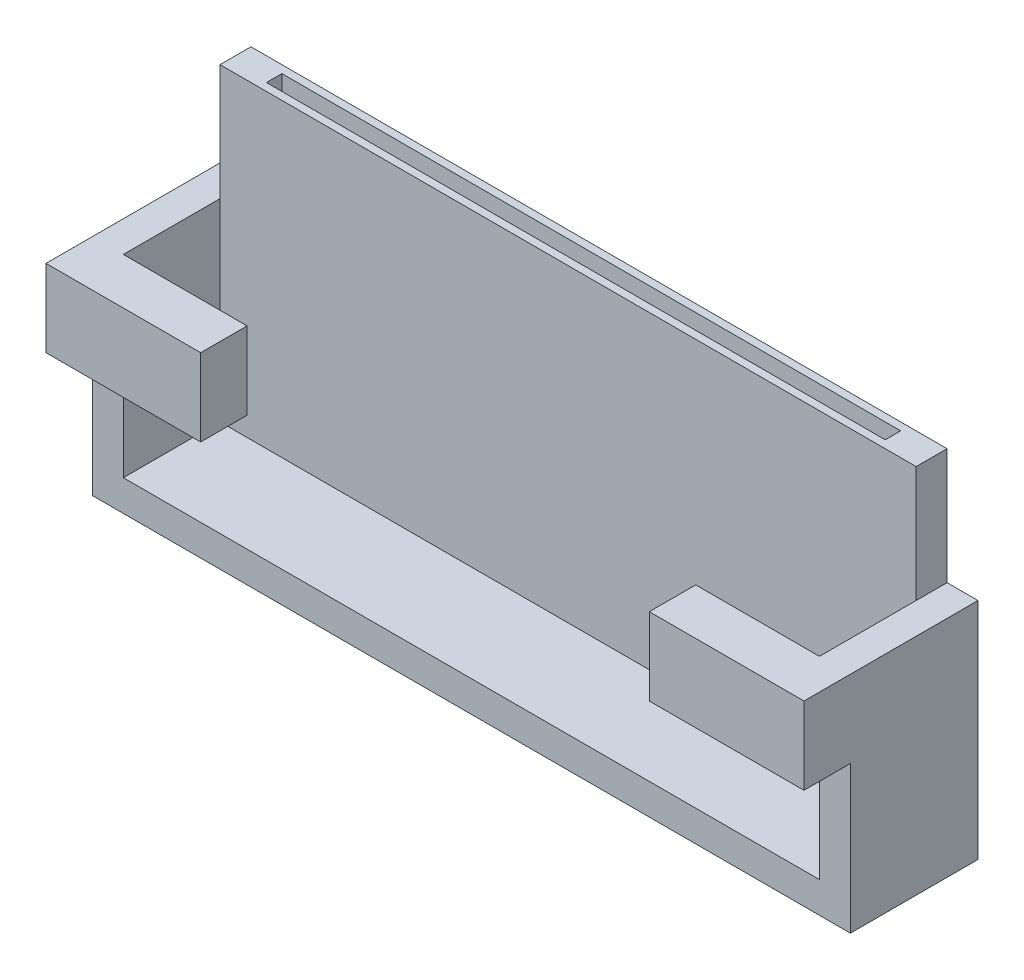
ISO-10303-21;
HEADER;
FILE_DESCRIPTION(('STEP AP214'),'2;1');
FILE_NAME('part.step','',(''),(''),'','','');
FILE_SCHEMA(('AUTOMOTIVE_DESIGN { 1 0 10303 214 1 1 1 1 }'));
ENDSEC;
DATA;
#1=APPLICATION_CONTEXT('core data for automotive mechanical design processes');
#2=APPLICATION_PROTOCOL_DEFINITION('international standard','automotive_design',2000,#1);
#3=PRODUCT_CONTEXT('',#1,'mechanical');
#4=PRODUCT('Part','Part','',(#3));
#5=PRODUCT_RELATED_PRODUCT_CATEGORY('part','',(#4));
#6=PRODUCT_DEFINITION_FORMATION('','',#4);
#7=PRODUCT_DEFINITION_CONTEXT('part definition',#1,'design');
#8=PRODUCT_DEFINITION('design','',#6,#7);
#9=PRODUCT_DEFINITION_SHAPE('','',#8);
#10=(LENGTH_UNIT() NAMED_UNIT(*) SI_UNIT(.MILLI.,.METRE.));
#11=(NAMED_UNIT(*) PLANE_ANGLE_UNIT() SI_UNIT($,.RADIAN.));
#12=(NAMED_UNIT(*) SI_UNIT($,.STERADIAN.) SOLID_ANGLE_UNIT());
#13=UNCERTAINTY_MEASURE_WITH_UNIT(LENGTH_MEASURE(1.E-05),#10,'distance_accuracy_value','');
#14=(GEOMETRIC_REPRESENTATION_CONTEXT(3) GLOBAL_UNCERTAINTY_ASSIGNED_CONTEXT((#13)) GLOBAL_UNIT_ASSIGNED_CONTEXT((#10,
#11,#12)) REPRESENTATION_CONTEXT('',''));
#15=CARTESIAN_POINT('',(0.,0.,0.));
#16=DIRECTION('',(0.,0.,1.));
#17=DIRECTION('',(1.,0.,0.));
#18=AXIS2_PLACEMENT_3D('',#15,#16,#17);
#19=CARTESIAN_POINT('',(22.5,0.,2.));
#20=DIRECTION('',(1.,0.,0.));
#21=DIRECTION('',(0.,1.,0.));
#22=AXIS2_PLACEMENT_3D('',#19,#20,#21);
#23=PLANE('',#22);
#24=DIRECTION('',(0.,0.,-1.));
#25=VECTOR('',#24,1.);
#26=CARTESIAN_POINT('',(22.5,2.5,8.25));
#27=LINE('',#26,#25);
#28=CARTESIAN_POINT('',(22.5,2.5,2.));
#29=VERTEX_POINT('',#28);
#30=CARTESIAN_POINT('',(22.5,2.5,0.));
#31=VERTEX_POINT('',#30);
#32=EDGE_CURVE('E520',#29,#31,#27,.T.);
#33=ORIENTED_EDGE('',*,*,#32,.T.);
#34=DIRECTION('',(0.,-1.,0.));
#35=VECTOR('',#34,1.);
#36=CARTESIAN_POINT('',(22.5,0.,0.));
#37=LINE('',#36,#35);
#38=CARTESIAN_POINT('',(22.5,10.,0.));
#39=VERTEX_POINT('',#38);
#40=EDGE_CURVE('E531',#39,#31,#37,.T.);
#41=ORIENTED_EDGE('',*,*,#40,.F.);
#42=DIRECTION('',(0.,0.,-1.));
#43=VECTOR('',#42,1.);
#44=CARTESIAN_POINT('',(22.5,10.,2.));
#45=LINE('',#44,#43);
#46=CARTESIAN_POINT('',(22.5,10.,2.));
#47=VERTEX_POINT('',#46);
#48=EDGE_CURVE('E79',#47,#39,#45,.T.);
#49=ORIENTED_EDGE('',*,*,#48,.F.);
#50=DIRECTION('',(0.,-1.,0.));
#51=VECTOR('',#50,1.);
#52=CARTESIAN_POINT('',(22.5,0.,2.));
#53=LINE('',#52,#51);
#54=EDGE_CURVE('E532',#47,#29,#53,.T.);
#55=ORIENTED_EDGE('',*,*,#54,.T.);
#56=EDGE_LOOP('',(#33,#41,#49,#55));
#57=FACE_BOUND('',#56,.T.);
#58=ADVANCED_FACE('F71',(#57),#23,.T.);
#59=CARTESIAN_POINT('',(0.,10.,2.));
#60=DIRECTION('',(0.,1.,0.));
#61=DIRECTION('',(0.,0.,1.));
#62=AXIS2_PLACEMENT_3D('',#59,#60,#61);
#63=PLANE('',#62);
#64=DIRECTION('',(0.,0.,1.));
#65=VECTOR('',#64,1.);
#66=CARTESIAN_POINT('',(-20.,10.,0.5));
#67=LINE('',#66,#65);
#68=CARTESIAN_POINT('',(-20.,10.,0.5));
#69=VERTEX_POINT('',#68);
#70=CARTESIAN_POINT('',(-20.,10.,1.5));
#71=VERTEX_POINT('',#70);
#72=EDGE_CURVE('E96',#69,#71,#67,.T.);
#73=ORIENTED_EDGE('',*,*,#72,.F.);
#74=DIRECTION('',(-1.,0.,0.));
#75=VECTOR('',#74,1.);
#76=CARTESIAN_POINT('',(-20.,10.,0.5));
#77=LINE('',#76,#75);
#78=CARTESIAN_POINT('',(20.,10.,0.5));
#79=VERTEX_POINT('',#78);
#80=EDGE_CURVE('E410',#79,#69,#77,.T.);
#81=ORIENTED_EDGE('',*,*,#80,.F.);
#82=DIRECTION('',(0.,0.,-1.));
#83=VECTOR('',#82,1.);
#84=CARTESIAN_POINT('',(20.,10.,0.5));
#85=LINE('',#84,#83);
#86=CARTESIAN_POINT('',(20.,10.,1.5));
#87=VERTEX_POINT('',#86);
#88=EDGE_CURVE('E402',#87,#79,#85,.T.);
#89=ORIENTED_EDGE('',*,*,#88,.F.);
#90=DIRECTION('',(1.,0.,0.));
#91=VECTOR('',#90,1.);
#92=CARTESIAN_POINT('',(-20.,10.,1.5));
#93=LINE('',#92,#91);
#94=EDGE_CURVE('E397',#71,#87,#93,.T.);
#95=ORIENTED_EDGE('',*,*,#94,.F.);
#96=EDGE_LOOP('',(#73,#81,#89,#95));
#97=FACE_BOUND('',#96,.T.);
#98=DIRECTION('',(1.,0.,0.));
#99=VECTOR('',#98,1.);
#100=CARTESIAN_POINT('',(0.,10.,0.));
#101=LINE('',#100,#99);
#102=CARTESIAN_POINT('',(-22.5,10.,0.));
#103=VERTEX_POINT('',#102);
#104=EDGE_CURVE('E547',#103,#39,#101,.T.);
#105=ORIENTED_EDGE('',*,*,#104,.F.);
#106=DIRECTION('',(0.,0.,-1.));
#107=VECTOR('',#106,1.);
#108=CARTESIAN_POINT('',(-22.5,10.,2.));
#109=LINE('',#108,#107);
#110=CARTESIAN_POINT('',(-22.5,10.,2.));
#111=VERTEX_POINT('',#110);
#112=EDGE_CURVE('E544',#111,#103,#109,.T.);
#113=ORIENTED_EDGE('',*,*,#112,.F.);
#114=DIRECTION('',(1.,0.,0.));
#115=VECTOR('',#114,1.);
#116=CARTESIAN_POINT('',(0.,10.,2.));
#117=LINE('',#116,#115);
#118=EDGE_CURVE('E535',#111,#47,#117,.T.);
#119=ORIENTED_EDGE('',*,*,#118,.T.);
#120=ORIENTED_EDGE('',*,*,#48,.T.);
#121=EDGE_LOOP('',(#105,#113,#119,#120));
#122=FACE_BOUND('',#121,.T.);
#123=ADVANCED_FACE('F556',(#97,#122),#63,.T.);
#124=CARTESIAN_POINT('',(-22.5,0.,2.));
#125=DIRECTION('',(1.,0.,0.));
#126=DIRECTION('',(0.,1.,0.));
#127=AXIS2_PLACEMENT_3D('',#124,#125,#126);
#128=PLANE('',#127);
#129=DIRECTION('',(0.,-1.,0.));
#130=VECTOR('',#129,1.);
#131=CARTESIAN_POINT('',(-22.5,0.,0.));
#132=LINE('',#131,#130);
#133=CARTESIAN_POINT('',(-22.5,2.5,0.));
#134=VERTEX_POINT('',#133);
#135=EDGE_CURVE('E536',#103,#134,#132,.T.);
#136=ORIENTED_EDGE('',*,*,#135,.T.);
#137=DIRECTION('',(0.,0.,-1.));
#138=VECTOR('',#137,1.);
#139=CARTESIAN_POINT('',(-22.5,2.5,8.25));
#140=LINE('',#139,#138);
#141=CARTESIAN_POINT('',(-22.5,2.5,2.));
#142=VERTEX_POINT('',#141);
#143=EDGE_CURVE('E510',#142,#134,#140,.T.);
#144=ORIENTED_EDGE('',*,*,#143,.F.);
#145=DIRECTION('',(0.,-1.,0.));
#146=VECTOR('',#145,1.);
#147=CARTESIAN_POINT('',(-22.5,0.,2.));
#148=LINE('',#147,#146);
#149=EDGE_CURVE('E539',#111,#142,#148,.T.);
#150=ORIENTED_EDGE('',*,*,#149,.F.);
#151=ORIENTED_EDGE('',*,*,#112,.T.);
#152=EDGE_LOOP('',(#136,#144,#150,#151));
#153=FACE_BOUND('',#152,.T.);
#154=ADVANCED_FACE('F566',(#153),#128,.F.);
#155=CARTESIAN_POINT('',(0.,0.,2.));
#156=DIRECTION('',(0.,0.,1.));
#157=DIRECTION('',(1.,0.,0.));
#158=AXIS2_PLACEMENT_3D('',#155,#156,#157);
#159=PLANE('',#158);
#160=ORIENTED_EDGE('',*,*,#54,.F.);
#161=ORIENTED_EDGE('',*,*,#118,.F.);
#162=ORIENTED_EDGE('',*,*,#149,.T.);
#163=DIRECTION('',(0.,1.,0.));
#164=VECTOR('',#163,1.);
#165=CARTESIAN_POINT('',(-22.5,0.,2.));
#166=LINE('',#165,#164);
#167=CARTESIAN_POINT('',(-22.5,-10.,2.));
#168=VERTEX_POINT('',#167);
#169=EDGE_CURVE('E526',#168,#142,#166,.T.);
#170=ORIENTED_EDGE('',*,*,#169,.F.);
#171=DIRECTION('',(1.,0.,0.));
#172=VECTOR('',#171,1.);
#173=CARTESIAN_POINT('',(0.,-10.,2.));
#174=LINE('',#173,#172);
#175=CARTESIAN_POINT('',(22.5,-10.,2.));
#176=VERTEX_POINT('',#175);
#177=EDGE_CURVE('E542',#168,#176,#174,.T.);
#178=ORIENTED_EDGE('',*,*,#177,.T.);
#179=DIRECTION('',(0.,1.,0.));
#180=VECTOR('',#179,1.);
#181=CARTESIAN_POINT('',(22.5,0.,2.));
#182=LINE('',#181,#180);
#183=EDGE_CURVE('E529',#176,#29,#182,.T.);
#184=ORIENTED_EDGE('',*,*,#183,.T.);
#185=EDGE_LOOP('',(#160,#161,#162,#170,#178,#184));
#186=FACE_BOUND('',#185,.T.);
#187=ADVANCED_FACE('F628',(#186),#159,.T.);
#188=CARTESIAN_POINT('',(0.,0.,0.));
#189=DIRECTION('',(0.,0.,1.));
#190=DIRECTION('',(1.,0.,0.));
#191=AXIS2_PLACEMENT_3D('',#188,#189,#190);
#192=PLANE('',#191);
#193=DIRECTION('',(1.,0.,0.));
#194=VECTOR('',#193,1.);
#195=CARTESIAN_POINT('',(7.50000000000001,1.5,0.));
#196=LINE('',#195,#194);
#197=CARTESIAN_POINT('',(-7.49999999999999,1.5,0.));
#198=VERTEX_POINT('',#197);
#199=CARTESIAN_POINT('',(7.50000000000001,1.5,0.));
#200=VERTEX_POINT('',#199);
#201=EDGE_CURVE('E259',#198,#200,#196,.T.);
#202=ORIENTED_EDGE('',*,*,#201,.F.);
#203=DIRECTION('',(0.,1.,0.));
#204=VECTOR('',#203,1.);
#205=CARTESIAN_POINT('',(-7.49999999999999,1.5,0.));
#206=LINE('',#205,#204);
#207=CARTESIAN_POINT('',(-7.5,-1.5,0.));
#208=VERTEX_POINT('',#207);
#209=EDGE_CURVE('E268',#208,#198,#206,.T.);
#210=ORIENTED_EDGE('',*,*,#209,.F.);
#211=DIRECTION('',(-1.,0.,0.));
#212=VECTOR('',#211,1.);
#213=CARTESIAN_POINT('',(7.50000000000001,-1.5,0.));
#214=LINE('',#213,#212);
#215=CARTESIAN_POINT('',(7.5,-1.5,0.));
#216=VERTEX_POINT('',#215);
#217=EDGE_CURVE('E266',#216,#208,#214,.T.);
#218=ORIENTED_EDGE('',*,*,#217,.F.);
#219=DIRECTION('',(0.,-1.,0.));
#220=VECTOR('',#219,1.);
#221=CARTESIAN_POINT('',(7.50000000000001,1.5,0.));
#222=LINE('',#221,#220);
#223=EDGE_CURVE('E251',#200,#216,#222,.T.);
#224=ORIENTED_EDGE('',*,*,#223,.F.);
#225=EDGE_LOOP('',(#202,#210,#218,#224));
#226=FACE_BOUND('',#225,.T.);
#227=ORIENTED_EDGE('',*,*,#40,.T.);
#228=DIRECTION('',(1.,0.,0.));
#229=VECTOR('',#228,1.);
#230=CARTESIAN_POINT('',(0.,2.5,0.));
#231=LINE('',#230,#229);
#232=CARTESIAN_POINT('',(24.5,2.5,0.));
#233=VERTEX_POINT('',#232);
#234=EDGE_CURVE('E496',#31,#233,#231,.T.);
#235=ORIENTED_EDGE('',*,*,#234,.T.);
#236=DIRECTION('',(0.,-1.,0.));
#237=VECTOR('',#236,1.);
#238=CARTESIAN_POINT('',(24.5,0.,0.));
#239=LINE('',#238,#237);
#240=CARTESIAN_POINT('',(24.5,-12.,0.));
#241=VERTEX_POINT('',#240);
#242=EDGE_CURVE('E451',#233,#241,#239,.T.);
#243=ORIENTED_EDGE('',*,*,#242,.T.);
#244=DIRECTION('',(1.,0.,0.));
#245=VECTOR('',#244,1.);
#246=CARTESIAN_POINT('',(0.,-12.,0.));
#247=LINE('',#246,#245);
#248=CARTESIAN_POINT('',(-24.5,-12.,0.));
#249=VERTEX_POINT('',#248);
#250=EDGE_CURVE('E478',#249,#241,#247,.T.);
#251=ORIENTED_EDGE('',*,*,#250,.F.);
#252=DIRECTION('',(0.,-1.,0.));
#253=VECTOR('',#252,1.);
#254=CARTESIAN_POINT('',(-24.5,0.,0.));
#255=LINE('',#254,#253);
#256=CARTESIAN_POINT('',(-24.5,2.5,0.));
#257=VERTEX_POINT('',#256);
#258=EDGE_CURVE('E500',#257,#249,#255,.T.);
#259=ORIENTED_EDGE('',*,*,#258,.F.);
#260=EDGE_CURVE('E499',#257,#134,#231,.T.);
#261=ORIENTED_EDGE('',*,*,#260,.T.);
#262=ORIENTED_EDGE('',*,*,#135,.F.);
#263=ORIENTED_EDGE('',*,*,#104,.T.);
#264=EDGE_LOOP('',(#227,#235,#243,#251,#259,#261,#262,#263));
#265=FACE_BOUND('',#264,.T.);
#266=ADVANCED_FACE('F264',(#226,#265),#192,.F.);
#267=CARTESIAN_POINT('',(24.5,0.,8.25));
#268=DIRECTION('',(1.,0.,0.));
#269=DIRECTION('',(0.,1.,0.));
#270=AXIS2_PLACEMENT_3D('',#267,#268,#269);
#271=PLANE('',#270);
#272=ORIENTED_EDGE('',*,*,#242,.F.);
#273=DIRECTION('',(0.,0.,-1.));
#274=VECTOR('',#273,1.);
#275=CARTESIAN_POINT('',(24.5,2.5,8.25));
#276=LINE('',#275,#274);
#277=CARTESIAN_POINT('',(24.5,2.50000000000004,11.25));
#278=VERTEX_POINT('',#277);
#279=EDGE_CURVE('E524',#278,#233,#276,.T.);
#280=ORIENTED_EDGE('',*,*,#279,.F.);
#281=DIRECTION('',(0.,1.,0.));
#282=VECTOR('',#281,1.);
#283=CARTESIAN_POINT('',(24.5,2.50000000000004,11.25));
#284=LINE('',#283,#282);
#285=CARTESIAN_POINT('',(24.5,-2.49999999999996,11.25));
#286=VERTEX_POINT('',#285);
#287=EDGE_CURVE('E459',#286,#278,#284,.T.);
#288=ORIENTED_EDGE('',*,*,#287,.F.);
#289=DIRECTION('',(0.,0.,-1.));
#290=VECTOR('',#289,1.);
#291=CARTESIAN_POINT('',(24.5,-2.49999999999996,11.25));
#292=LINE('',#291,#290);
#293=CARTESIAN_POINT('',(24.5,-2.49999999999996,8.25));
#294=VERTEX_POINT('',#293);
#295=EDGE_CURVE('E457',#286,#294,#292,.T.);
#296=ORIENTED_EDGE('',*,*,#295,.T.);
#297=DIRECTION('',(0.,-1.,0.));
#298=VECTOR('',#297,1.);
#299=CARTESIAN_POINT('',(24.5,0.,8.25));
#300=LINE('',#299,#298);
#301=CARTESIAN_POINT('',(24.5,-12.,8.25));
#302=VERTEX_POINT('',#301);
#303=EDGE_CURVE('E475',#294,#302,#300,.T.);
#304=ORIENTED_EDGE('',*,*,#303,.T.);
#305=DIRECTION('',(0.,0.,-1.));
#306=VECTOR('',#305,1.);
#307=CARTESIAN_POINT('',(24.5,-12.,8.25));
#308=LINE('',#307,#306);
#309=EDGE_CURVE('E493',#302,#241,#308,.T.);
#310=ORIENTED_EDGE('',*,*,#309,.T.);
#311=EDGE_LOOP('',(#272,#280,#288,#296,#304,#310));
#312=FACE_BOUND('',#311,.T.);
#313=ADVANCED_FACE('F604',(#312),#271,.T.);
#314=CARTESIAN_POINT('',(0.,2.5,8.25));
#315=DIRECTION('',(0.,1.,0.));
#316=DIRECTION('',(0.,0.,1.));
#317=AXIS2_PLACEMENT_3D('',#314,#315,#316);
#318=PLANE('',#317);
#319=ORIENTED_EDGE('',*,*,#234,.F.);
#320=ORIENTED_EDGE('',*,*,#32,.F.);
#321=CARTESIAN_POINT('',(22.5,2.5,8.25));
#322=VERTEX_POINT('',#321);
#323=EDGE_CURVE('E521',#322,#29,#27,.T.);
#324=ORIENTED_EDGE('',*,*,#323,.F.);
#325=DIRECTION('',(-1.,0.,0.));
#326=VECTOR('',#325,1.);
#327=CARTESIAN_POINT('',(24.5,2.50000000000004,8.25));
#328=LINE('',#327,#326);
#329=CARTESIAN_POINT('',(14.5,2.50000000000002,8.25));
#330=VERTEX_POINT('',#329);
#331=EDGE_CURVE('E465',#322,#330,#328,.T.);
#332=ORIENTED_EDGE('',*,*,#331,.T.);
#333=DIRECTION('',(0.,0.,-1.));
#334=VECTOR('',#333,1.);
#335=CARTESIAN_POINT('',(14.5,2.50000000000002,11.25));
#336=LINE('',#335,#334);
#337=CARTESIAN_POINT('',(14.5,2.50000000000002,11.25));
#338=VERTEX_POINT('',#337);
#339=EDGE_CURVE('E416',#338,#330,#336,.T.);
#340=ORIENTED_EDGE('',*,*,#339,.F.);
#341=DIRECTION('',(-1.,0.,0.));
#342=VECTOR('',#341,1.);
#343=CARTESIAN_POINT('',(24.5,2.50000000000004,11.25));
#344=LINE('',#343,#342);
#345=EDGE_CURVE('E463',#278,#338,#344,.T.);
#346=ORIENTED_EDGE('',*,*,#345,.F.);
#347=ORIENTED_EDGE('',*,*,#279,.T.);
#348=EDGE_LOOP('',(#319,#320,#324,#332,#340,#346,#347));
#349=FACE_BOUND('',#348,.T.);
#350=ADVANCED_FACE('F610',(#349),#318,.T.);
#351=CARTESIAN_POINT('',(22.5,0.,8.25));
#352=DIRECTION('',(1.,0.,0.));
#353=DIRECTION('',(0.,1.,0.));
#354=AXIS2_PLACEMENT_3D('',#351,#352,#353);
#355=PLANE('',#354);
#356=ORIENTED_EDGE('',*,*,#183,.F.);
#357=DIRECTION('',(0.,0.,-1.));
#358=VECTOR('',#357,1.);
#359=CARTESIAN_POINT('',(22.5,-10.,8.25));
#360=LINE('',#359,#358);
#361=CARTESIAN_POINT('',(22.5,-10.,8.25));
#362=VERTEX_POINT('',#361);
#363=EDGE_CURVE('E517',#362,#176,#360,.T.);
#364=ORIENTED_EDGE('',*,*,#363,.F.);
#365=DIRECTION('',(0.,-1.,0.));
#366=VECTOR('',#365,1.);
#367=CARTESIAN_POINT('',(22.5,0.,8.25));
#368=LINE('',#367,#366);
#369=CARTESIAN_POINT('',(22.5,-2.49999999999997,8.25));
#370=VERTEX_POINT('',#369);
#371=EDGE_CURVE('E477',#370,#362,#368,.T.);
#372=ORIENTED_EDGE('',*,*,#371,.F.);
#373=EDGE_CURVE('E479',#322,#370,#368,.T.);
#374=ORIENTED_EDGE('',*,*,#373,.F.);
#375=ORIENTED_EDGE('',*,*,#323,.T.);
#376=EDGE_LOOP('',(#356,#364,#372,#374,#375));
#377=FACE_BOUND('',#376,.T.);
#378=ADVANCED_FACE('F621',(#377),#355,.F.);
#379=CARTESIAN_POINT('',(0.,-10.,8.25));
#380=DIRECTION('',(0.,1.,0.));
#381=DIRECTION('',(0.,0.,1.));
#382=AXIS2_PLACEMENT_3D('',#379,#380,#381);
#383=PLANE('',#382);
#384=ORIENTED_EDGE('',*,*,#363,.T.);
#385=ORIENTED_EDGE('',*,*,#177,.F.);
#386=DIRECTION('',(0.,0.,-1.));
#387=VECTOR('',#386,1.);
#388=CARTESIAN_POINT('',(-22.5,-10.,8.25));
#389=LINE('',#388,#387);
#390=CARTESIAN_POINT('',(-22.5,-10.,8.25));
#391=VERTEX_POINT('',#390);
#392=EDGE_CURVE('E514',#391,#168,#389,.T.);
#393=ORIENTED_EDGE('',*,*,#392,.F.);
#394=DIRECTION('',(1.,0.,0.));
#395=VECTOR('',#394,1.);
#396=CARTESIAN_POINT('',(0.,-10.,8.25));
#397=LINE('',#396,#395);
#398=EDGE_CURVE('E482',#391,#362,#397,.T.);
#399=ORIENTED_EDGE('',*,*,#398,.T.);
#400=EDGE_LOOP('',(#384,#385,#393,#399));
#401=FACE_BOUND('',#400,.T.);
#402=ADVANCED_FACE('F625',(#401),#383,.T.);
#403=CARTESIAN_POINT('',(-22.5,0.,8.25));
#404=DIRECTION('',(1.,0.,0.));
#405=DIRECTION('',(0.,1.,0.));
#406=AXIS2_PLACEMENT_3D('',#403,#404,#405);
#407=PLANE('',#406);
#408=ORIENTED_EDGE('',*,*,#392,.T.);
#409=ORIENTED_EDGE('',*,*,#169,.T.);
#410=CARTESIAN_POINT('',(-22.5,2.5,8.25));
#411=VERTEX_POINT('',#410);
#412=EDGE_CURVE('E511',#411,#142,#140,.T.);
#413=ORIENTED_EDGE('',*,*,#412,.F.);
#414=DIRECTION('',(0.,-1.,0.));
#415=VECTOR('',#414,1.);
#416=CARTESIAN_POINT('',(-22.5,0.,8.25));
#417=LINE('',#416,#415);
#418=CARTESIAN_POINT('',(-22.5,-2.5,8.25));
#419=VERTEX_POINT('',#418);
#420=EDGE_CURVE('E486',#411,#419,#417,.T.);
#421=ORIENTED_EDGE('',*,*,#420,.T.);
#422=EDGE_CURVE('E485',#419,#391,#417,.T.);
#423=ORIENTED_EDGE('',*,*,#422,.T.);
#424=EDGE_LOOP('',(#408,#409,#413,#421,#423));
#425=FACE_BOUND('',#424,.T.);
#426=ADVANCED_FACE('F572',(#425),#407,.T.);
#427=ORIENTED_EDGE('',*,*,#260,.F.);
#428=DIRECTION('',(0.,0.,-1.));
#429=VECTOR('',#428,1.);
#430=CARTESIAN_POINT('',(-24.5,2.5,8.25));
#431=LINE('',#430,#429);
#432=CARTESIAN_POINT('',(-24.5,2.5,11.25));
#433=VERTEX_POINT('',#432);
#434=EDGE_CURVE('E508',#433,#257,#431,.T.);
#435=ORIENTED_EDGE('',*,*,#434,.F.);
#436=DIRECTION('',(-1.,0.,0.));
#437=VECTOR('',#436,1.);
#438=CARTESIAN_POINT('',(-24.5,2.5,11.25));
#439=LINE('',#438,#437);
#440=CARTESIAN_POINT('',(-14.5,2.5,11.25));
#441=VERTEX_POINT('',#440);
#442=EDGE_CURVE('E431',#441,#433,#439,.T.);
#443=ORIENTED_EDGE('',*,*,#442,.F.);
#444=DIRECTION('',(0.,0.,-1.));
#445=VECTOR('',#444,1.);
#446=CARTESIAN_POINT('',(-14.5,2.5,11.25));
#447=LINE('',#446,#445);
#448=CARTESIAN_POINT('',(-14.5,2.5,8.25));
#449=VERTEX_POINT('',#448);
#450=EDGE_CURVE('E434',#441,#449,#447,.T.);
#451=ORIENTED_EDGE('',*,*,#450,.T.);
#452=DIRECTION('',(-1.,0.,0.));
#453=VECTOR('',#452,1.);
#454=CARTESIAN_POINT('',(-24.5,2.5,8.25));
#455=LINE('',#454,#453);
#456=EDGE_CURVE('E427',#449,#411,#455,.T.);
#457=ORIENTED_EDGE('',*,*,#456,.T.);
#458=ORIENTED_EDGE('',*,*,#412,.T.);
#459=ORIENTED_EDGE('',*,*,#143,.T.);
#460=EDGE_LOOP('',(#427,#435,#443,#451,#457,#458,#459));
#461=FACE_BOUND('',#460,.T.);
#462=ADVANCED_FACE('F568',(#461),#318,.T.);
#463=CARTESIAN_POINT('',(-24.5,0.,8.25));
#464=DIRECTION('',(1.,0.,0.));
#465=DIRECTION('',(0.,1.,0.));
#466=AXIS2_PLACEMENT_3D('',#463,#464,#465);
#467=PLANE('',#466);
#468=ORIENTED_EDGE('',*,*,#258,.T.);
#469=DIRECTION('',(0.,0.,-1.));
#470=VECTOR('',#469,1.);
#471=CARTESIAN_POINT('',(-24.5,-12.,8.25));
#472=LINE('',#471,#470);
#473=CARTESIAN_POINT('',(-24.5,-12.,8.25));
#474=VERTEX_POINT('',#473);
#475=EDGE_CURVE('E505',#474,#249,#472,.T.);
#476=ORIENTED_EDGE('',*,*,#475,.F.);
#477=DIRECTION('',(0.,-1.,0.));
#478=VECTOR('',#477,1.);
#479=CARTESIAN_POINT('',(-24.5,0.,8.25));
#480=LINE('',#479,#478);
#481=CARTESIAN_POINT('',(-24.5,-2.5,8.25));
#482=VERTEX_POINT('',#481);
#483=EDGE_CURVE('E488',#482,#474,#480,.T.);
#484=ORIENTED_EDGE('',*,*,#483,.F.);
#485=DIRECTION('',(0.,0.,-1.));
#486=VECTOR('',#485,1.);
#487=CARTESIAN_POINT('',(-24.5,-2.5,11.25));
#488=LINE('',#487,#486);
#489=CARTESIAN_POINT('',(-24.5,-2.5,11.25));
#490=VERTEX_POINT('',#489);
#491=EDGE_CURVE('E448',#490,#482,#488,.T.);
#492=ORIENTED_EDGE('',*,*,#491,.F.);
#493=DIRECTION('',(0.,-1.,0.));
#494=VECTOR('',#493,1.);
#495=CARTESIAN_POINT('',(-24.5,2.5,11.25));
#496=LINE('',#495,#494);
#497=EDGE_CURVE('E423',#433,#490,#496,.T.);
#498=ORIENTED_EDGE('',*,*,#497,.F.);
#499=ORIENTED_EDGE('',*,*,#434,.T.);
#500=EDGE_LOOP('',(#468,#476,#484,#492,#498,#499));
#501=FACE_BOUND('',#500,.T.);
#502=ADVANCED_FACE('F588',(#501),#467,.F.);
#503=CARTESIAN_POINT('',(0.,-12.,8.25));
#504=DIRECTION('',(0.,1.,0.));
#505=DIRECTION('',(0.,0.,1.));
#506=AXIS2_PLACEMENT_3D('',#503,#504,#505);
#507=PLANE('',#506);
#508=ORIENTED_EDGE('',*,*,#250,.T.);
#509=ORIENTED_EDGE('',*,*,#309,.F.);
#510=DIRECTION('',(1.,0.,0.));
#511=VECTOR('',#510,1.);
#512=CARTESIAN_POINT('',(0.,-12.,8.25));
#513=LINE('',#512,#511);
#514=EDGE_CURVE('E490',#474,#302,#513,.T.);
#515=ORIENTED_EDGE('',*,*,#514,.F.);
#516=ORIENTED_EDGE('',*,*,#475,.T.);
#517=EDGE_LOOP('',(#508,#509,#515,#516));
#518=FACE_BOUND('',#517,.T.);
#519=ADVANCED_FACE('F594',(#518),#507,.F.);
#520=CARTESIAN_POINT('',(0.,0.,8.25));
#521=DIRECTION('',(0.,0.,1.));
#522=DIRECTION('',(1.,0.,0.));
#523=AXIS2_PLACEMENT_3D('',#520,#521,#522);
#524=PLANE('',#523);
#525=DIRECTION('',(1.,0.,0.));
#526=VECTOR('',#525,1.);
#527=CARTESIAN_POINT('',(-24.5,-2.5,8.25));
#528=LINE('',#527,#526);
#529=EDGE_CURVE('E435',#482,#419,#528,.T.);
#530=ORIENTED_EDGE('',*,*,#529,.F.);
#531=ORIENTED_EDGE('',*,*,#483,.T.);
#532=ORIENTED_EDGE('',*,*,#514,.T.);
#533=ORIENTED_EDGE('',*,*,#303,.F.);
#534=DIRECTION('',(1.,0.,0.));
#535=VECTOR('',#534,1.);
#536=CARTESIAN_POINT('',(24.5,-2.49999999999996,8.25));
#537=LINE('',#536,#535);
#538=EDGE_CURVE('E12',#370,#294,#537,.T.);
#539=ORIENTED_EDGE('',*,*,#538,.F.);
#540=ORIENTED_EDGE('',*,*,#371,.T.);
#541=ORIENTED_EDGE('',*,*,#398,.F.);
#542=ORIENTED_EDGE('',*,*,#422,.F.);
#543=EDGE_LOOP('',(#530,#531,#532,#533,#539,#540,#541,#542));
#544=FACE_BOUND('',#543,.T.);
#545=ADVANCED_FACE('F584',(#544),#524,.T.);
#546=CARTESIAN_POINT('',(0.,0.,8.25));
#547=DIRECTION('',(0.,0.,1.));
#548=DIRECTION('',(1.,0.,0.));
#549=AXIS2_PLACEMENT_3D('',#546,#547,#548);
#550=PLANE('',#549);
#551=ORIENTED_EDGE('',*,*,#331,.F.);
#552=ORIENTED_EDGE('',*,*,#373,.T.);
#553=CARTESIAN_POINT('',(14.5,-2.49999999999998,8.25));
#554=VERTEX_POINT('',#553);
#555=EDGE_CURVE('E81',#554,#370,#537,.T.);
#556=ORIENTED_EDGE('',*,*,#555,.F.);
#557=DIRECTION('',(0.,-1.,0.));
#558=VECTOR('',#557,1.);
#559=CARTESIAN_POINT('',(14.5,2.50000000000002,8.25));
#560=LINE('',#559,#558);
#561=EDGE_CURVE('E462',#330,#554,#560,.T.);
#562=ORIENTED_EDGE('',*,*,#561,.F.);
#563=EDGE_LOOP('',(#551,#552,#556,#562));
#564=FACE_BOUND('',#563,.T.);
#565=ADVANCED_FACE('F617',(#564),#550,.F.);
#566=CARTESIAN_POINT('',(14.5,2.50000000000002,11.25));
#567=DIRECTION('',(1.,0.,0.));
#568=DIRECTION('',(0.,1.,0.));
#569=AXIS2_PLACEMENT_3D('',#566,#567,#568);
#570=PLANE('',#569);
#571=ORIENTED_EDGE('',*,*,#561,.T.);
#572=DIRECTION('',(0.,0.,-1.));
#573=VECTOR('',#572,1.);
#574=CARTESIAN_POINT('',(14.5,-2.49999999999998,11.25));
#575=LINE('',#574,#573);
#576=CARTESIAN_POINT('',(14.5,-2.49999999999998,11.25));
#577=VERTEX_POINT('',#576);
#578=EDGE_CURVE('E454',#577,#554,#575,.T.);
#579=ORIENTED_EDGE('',*,*,#578,.F.);
#580=DIRECTION('',(0.,-1.,0.));
#581=VECTOR('',#580,1.);
#582=CARTESIAN_POINT('',(14.5,2.50000000000002,11.25));
#583=LINE('',#582,#581);
#584=EDGE_CURVE('E471',#338,#577,#583,.T.);
#585=ORIENTED_EDGE('',*,*,#584,.F.);
#586=ORIENTED_EDGE('',*,*,#339,.T.);
#587=EDGE_LOOP('',(#571,#579,#585,#586));
#588=FACE_BOUND('',#587,.T.);
#589=ADVANCED_FACE('F614',(#588),#570,.F.);
#590=CARTESIAN_POINT('',(24.5,-2.49999999999996,11.25));
#591=DIRECTION('',(0.,1.,0.));
#592=DIRECTION('',(-1.,0.,0.));
#593=AXIS2_PLACEMENT_3D('',#590,#591,#592);
#594=PLANE('',#593);
#595=ORIENTED_EDGE('',*,*,#555,.T.);
#596=ORIENTED_EDGE('',*,*,#538,.T.);
#597=ORIENTED_EDGE('',*,*,#295,.F.);
#598=DIRECTION('',(1.,0.,0.));
#599=VECTOR('',#598,1.);
#600=CARTESIAN_POINT('',(24.5,-2.49999999999996,11.25));
#601=LINE('',#600,#599);
#602=EDGE_CURVE('E469',#577,#286,#601,.T.);
#603=ORIENTED_EDGE('',*,*,#602,.F.);
#604=ORIENTED_EDGE('',*,*,#578,.T.);
#605=EDGE_LOOP('',(#595,#596,#597,#603,#604));
#606=FACE_BOUND('',#605,.T.);
#607=ADVANCED_FACE('F599',(#606),#594,.F.);
#608=CARTESIAN_POINT('',(0.,0.,11.25));
#609=DIRECTION('',(0.,0.,1.));
#610=DIRECTION('',(1.,0.,0.));
#611=AXIS2_PLACEMENT_3D('',#608,#609,#610);
#612=PLANE('',#611);
#613=ORIENTED_EDGE('',*,*,#345,.T.);
#614=ORIENTED_EDGE('',*,*,#584,.T.);
#615=ORIENTED_EDGE('',*,*,#602,.T.);
#616=ORIENTED_EDGE('',*,*,#287,.T.);
#617=EDGE_LOOP('',(#613,#614,#615,#616));
#618=FACE_BOUND('',#617,.T.);
#619=ADVANCED_FACE('F607',(#618),#612,.T.);
#620=CARTESIAN_POINT('',(-24.5,-2.5,11.25));
#621=DIRECTION('',(0.,1.,0.));
#622=DIRECTION('',(0.,0.,1.));
#623=AXIS2_PLACEMENT_3D('',#620,#621,#622);
#624=PLANE('',#623);
#625=ORIENTED_EDGE('',*,*,#529,.T.);
#626=CARTESIAN_POINT('',(-14.5,-2.5,8.25));
#627=VERTEX_POINT('',#626);
#628=EDGE_CURVE('E439',#419,#627,#528,.T.);
#629=ORIENTED_EDGE('',*,*,#628,.T.);
#630=DIRECTION('',(0.,0.,-1.));
#631=VECTOR('',#630,1.);
#632=CARTESIAN_POINT('',(-14.5,-2.5,11.25));
#633=LINE('',#632,#631);
#634=CARTESIAN_POINT('',(-14.5,-2.5,11.25));
#635=VERTEX_POINT('',#634);
#636=EDGE_CURVE('E445',#635,#627,#633,.T.);
#637=ORIENTED_EDGE('',*,*,#636,.F.);
#638=DIRECTION('',(1.,0.,0.));
#639=VECTOR('',#638,1.);
#640=CARTESIAN_POINT('',(-24.5,-2.5,11.25));
#641=LINE('',#640,#639);
#642=EDGE_CURVE('E426',#490,#635,#641,.T.);
#643=ORIENTED_EDGE('',*,*,#642,.F.);
#644=ORIENTED_EDGE('',*,*,#491,.T.);
#645=EDGE_LOOP('',(#625,#629,#637,#643,#644));
#646=FACE_BOUND('',#645,.T.);
#647=ADVANCED_FACE('F580',(#646),#624,.F.);
#648=CARTESIAN_POINT('',(-14.5,2.5,11.25));
#649=DIRECTION('',(-1.,0.,0.));
#650=DIRECTION('',(0.,0.,1.));
#651=AXIS2_PLACEMENT_3D('',#648,#649,#650);
#652=PLANE('',#651);
#653=DIRECTION('',(0.,1.,0.));
#654=VECTOR('',#653,1.);
#655=CARTESIAN_POINT('',(-14.5,2.5,8.25));
#656=LINE('',#655,#654);
#657=EDGE_CURVE('E438',#627,#449,#656,.T.);
#658=ORIENTED_EDGE('',*,*,#657,.T.);
#659=ORIENTED_EDGE('',*,*,#450,.F.);
#660=DIRECTION('',(0.,1.,0.));
#661=VECTOR('',#660,1.);
#662=CARTESIAN_POINT('',(-14.5,2.5,11.25));
#663=LINE('',#662,#661);
#664=EDGE_CURVE('E429',#635,#441,#663,.T.);
#665=ORIENTED_EDGE('',*,*,#664,.F.);
#666=ORIENTED_EDGE('',*,*,#636,.T.);
#667=EDGE_LOOP('',(#658,#659,#665,#666));
#668=FACE_BOUND('',#667,.T.);
#669=ADVANCED_FACE('F690',(#668),#652,.F.);
#670=CARTESIAN_POINT('',(0.,0.,11.25));
#671=DIRECTION('',(0.,0.,1.));
#672=DIRECTION('',(1.,0.,0.));
#673=AXIS2_PLACEMENT_3D('',#670,#671,#672);
#674=PLANE('',#673);
#675=ORIENTED_EDGE('',*,*,#497,.T.);
#676=ORIENTED_EDGE('',*,*,#642,.T.);
#677=ORIENTED_EDGE('',*,*,#664,.T.);
#678=ORIENTED_EDGE('',*,*,#442,.T.);
#679=EDGE_LOOP('',(#675,#676,#677,#678));
#680=FACE_BOUND('',#679,.T.);
#681=ADVANCED_FACE('F687',(#680),#674,.T.);
#682=CARTESIAN_POINT('',(0.,0.,8.25));
#683=DIRECTION('',(0.,0.,1.));
#684=DIRECTION('',(1.,0.,0.));
#685=AXIS2_PLACEMENT_3D('',#682,#683,#684);
#686=PLANE('',#685);
#687=ORIENTED_EDGE('',*,*,#420,.F.);
#688=ORIENTED_EDGE('',*,*,#456,.F.);
#689=ORIENTED_EDGE('',*,*,#657,.F.);
#690=ORIENTED_EDGE('',*,*,#628,.F.);
#691=EDGE_LOOP('',(#687,#688,#689,#690));
#692=FACE_BOUND('',#691,.T.);
#693=ADVANCED_FACE('F576',(#692),#686,.F.);
#694=CARTESIAN_POINT('',(-20.,8.,0.5));
#695=DIRECTION('',(-1.,0.,0.));
#696=DIRECTION('',(0.,0.,1.));
#697=AXIS2_PLACEMENT_3D('',#694,#695,#696);
#698=PLANE('',#697);
#699=ORIENTED_EDGE('',*,*,#72,.T.);
#700=DIRECTION('',(0.,1.,0.));
#701=VECTOR('',#700,1.);
#702=CARTESIAN_POINT('',(-20.,8.,1.5));
#703=LINE('',#702,#701);
#704=CARTESIAN_POINT('',(-20.,8.,1.5));
#705=VERTEX_POINT('',#704);
#706=EDGE_CURVE('E421',#705,#71,#703,.T.);
#707=ORIENTED_EDGE('',*,*,#706,.F.);
#708=DIRECTION('',(0.,0.,1.));
#709=VECTOR('',#708,1.);
#710=CARTESIAN_POINT('',(-20.,8.,0.5));
#711=LINE('',#710,#709);
#712=CARTESIAN_POINT('',(-20.,8.,0.5));
#713=VERTEX_POINT('',#712);
#714=EDGE_CURVE('E413',#713,#705,#711,.T.);
#715=ORIENTED_EDGE('',*,*,#714,.F.);
#716=DIRECTION('',(0.,1.,0.));
#717=VECTOR('',#716,1.);
#718=CARTESIAN_POINT('',(-20.,8.,0.5));
#719=LINE('',#718,#717);
#720=EDGE_CURVE('E414',#713,#69,#719,.T.);
#721=ORIENTED_EDGE('',*,*,#720,.T.);
#722=EDGE_LOOP('',(#699,#707,#715,#721));
#723=FACE_BOUND('',#722,.T.);
#724=ADVANCED_FACE('F659',(#723),#698,.F.);
#725=CARTESIAN_POINT('',(-20.,8.,0.5));
#726=DIRECTION('',(0.,0.,-1.));
#727=DIRECTION('',(-1.,0.,0.));
#728=AXIS2_PLACEMENT_3D('',#725,#726,#727);
#729=PLANE('',#728);
#730=ORIENTED_EDGE('',*,*,#80,.T.);
#731=ORIENTED_EDGE('',*,*,#720,.F.);
#732=DIRECTION('',(-1.,0.,0.));
#733=VECTOR('',#732,1.);
#734=CARTESIAN_POINT('',(-20.,8.,0.5));
#735=LINE('',#734,#733);
#736=CARTESIAN_POINT('',(20.,8.,0.5));
#737=VERTEX_POINT('',#736);
#738=EDGE_CURVE('E405',#737,#713,#735,.T.);
#739=ORIENTED_EDGE('',*,*,#738,.F.);
#740=DIRECTION('',(0.,1.,0.));
#741=VECTOR('',#740,1.);
#742=CARTESIAN_POINT('',(20.,8.,0.5));
#743=LINE('',#742,#741);
#744=EDGE_CURVE('E417',#737,#79,#743,.T.);
#745=ORIENTED_EDGE('',*,*,#744,.T.);
#746=EDGE_LOOP('',(#730,#731,#739,#745));
#747=FACE_BOUND('',#746,.T.);
#748=ADVANCED_FACE('F675',(#747),#729,.F.);
#749=CARTESIAN_POINT('',(20.,8.,0.5));
#750=DIRECTION('',(1.,0.,0.));
#751=DIRECTION('',(0.,0.,-1.));
#752=AXIS2_PLACEMENT_3D('',#749,#750,#751);
#753=PLANE('',#752);
#754=ORIENTED_EDGE('',*,*,#88,.T.);
#755=ORIENTED_EDGE('',*,*,#744,.F.);
#756=DIRECTION('',(0.,0.,-1.));
#757=VECTOR('',#756,1.);
#758=CARTESIAN_POINT('',(20.,8.,0.5));
#759=LINE('',#758,#757);
#760=CARTESIAN_POINT('',(20.,8.,1.5));
#761=VERTEX_POINT('',#760);
#762=EDGE_CURVE('E665',#761,#737,#759,.T.);
#763=ORIENTED_EDGE('',*,*,#762,.F.);
#764=DIRECTION('',(0.,1.,0.));
#765=VECTOR('',#764,1.);
#766=CARTESIAN_POINT('',(20.,8.,1.5));
#767=LINE('',#766,#765);
#768=EDGE_CURVE('E419',#761,#87,#767,.T.);
#769=ORIENTED_EDGE('',*,*,#768,.T.);
#770=EDGE_LOOP('',(#754,#755,#763,#769));
#771=FACE_BOUND('',#770,.T.);
#772=ADVANCED_FACE('F677',(#771),#753,.F.);
#773=CARTESIAN_POINT('',(-20.,8.,1.5));
#774=DIRECTION('',(0.,0.,1.));
#775=DIRECTION('',(1.,0.,0.));
#776=AXIS2_PLACEMENT_3D('',#773,#774,#775);
#777=PLANE('',#776);
#778=ORIENTED_EDGE('',*,*,#94,.T.);
#779=ORIENTED_EDGE('',*,*,#768,.F.);
#780=DIRECTION('',(1.,0.,0.));
#781=VECTOR('',#780,1.);
#782=CARTESIAN_POINT('',(-20.,8.,1.5));
#783=LINE('',#782,#781);
#784=EDGE_CURVE('E656',#705,#761,#783,.T.);
#785=ORIENTED_EDGE('',*,*,#784,.F.);
#786=ORIENTED_EDGE('',*,*,#706,.T.);
#787=EDGE_LOOP('',(#778,#779,#785,#786));
#788=FACE_BOUND('',#787,.T.);
#789=ADVANCED_FACE('F652',(#788),#777,.F.);
#790=CARTESIAN_POINT('',(0.,8.,0.));
#791=DIRECTION('',(0.,1.,0.));
#792=DIRECTION('',(0.,0.,1.));
#793=AXIS2_PLACEMENT_3D('',#790,#791,#792);
#794=PLANE('',#793);
#795=ORIENTED_EDGE('',*,*,#714,.T.);
#796=ORIENTED_EDGE('',*,*,#784,.T.);
#797=ORIENTED_EDGE('',*,*,#762,.T.);
#798=ORIENTED_EDGE('',*,*,#738,.T.);
#799=EDGE_LOOP('',(#795,#796,#797,#798));
#800=FACE_BOUND('',#799,.T.);
#801=ADVANCED_FACE('F363',(#800),#794,.T.);
#802=CARTESIAN_POINT('',(0.,0.,-5.));
#803=DIRECTION('',(0.,0.,1.));
#804=DIRECTION('',(1.,0.,0.));
#805=AXIS2_PLACEMENT_3D('',#802,#803,#804);
#806=PLANE('',#805);
#807=DIRECTION('',(0.,1.,0.));
#808=VECTOR('',#807,1.);
#809=CARTESIAN_POINT('',(7.49999999999999,2.5,-5.));
#810=LINE('',#809,#808);
#811=CARTESIAN_POINT('',(7.49999999999999,-2.5,-5.));
#812=VERTEX_POINT('',#811);
#813=CARTESIAN_POINT('',(7.49999999999999,2.5,-5.));
#814=VERTEX_POINT('',#813);
#815=EDGE_CURVE('E254',#812,#814,#810,.T.);
#816=ORIENTED_EDGE('',*,*,#815,.F.);
#817=DIRECTION('',(1.,0.,0.));
#818=VECTOR('',#817,1.);
#819=CARTESIAN_POINT('',(-7.50000000000001,-2.5,-5.));
#820=LINE('',#819,#818);
#821=CARTESIAN_POINT('',(-7.50000000000001,-2.5,-5.));
#822=VERTEX_POINT('',#821);
#823=EDGE_CURVE('E290',#822,#812,#820,.T.);
#824=ORIENTED_EDGE('',*,*,#823,.F.);
#825=DIRECTION('',(0.,-1.,0.));
#826=VECTOR('',#825,1.);
#827=CARTESIAN_POINT('',(-7.50000000000001,2.5,-5.));
#828=LINE('',#827,#826);
#829=CARTESIAN_POINT('',(-7.50000000000001,2.5,-5.));
#830=VERTEX_POINT('',#829);
#831=EDGE_CURVE('E285',#830,#822,#828,.T.);
#832=ORIENTED_EDGE('',*,*,#831,.F.);
#833=DIRECTION('',(-1.,0.,0.));
#834=VECTOR('',#833,1.);
#835=CARTESIAN_POINT('',(-7.50000000000001,2.5,-5.));
#836=LINE('',#835,#834);
#837=EDGE_CURVE('E306',#814,#830,#836,.T.);
#838=ORIENTED_EDGE('',*,*,#837,.F.);
#839=EDGE_LOOP('',(#816,#824,#832,#838));
#840=FACE_BOUND('',#839,.T.);
#841=ADVANCED_FACE('F321',(#840),#806,.F.);
#842=CARTESIAN_POINT('',(-7.5,1.5,0.));
#843=CARTESIAN_POINT('',(-7.5,1.5,-1.69967317119759));
#844=CARTESIAN_POINT('',(-7.5,2.,-3.3498365855988));
#845=CARTESIAN_POINT('',(-7.50000000000001,2.5,-5.));
#846=CARTESIAN_POINT('',(-2.49999999999999,1.5,0.));
#847=CARTESIAN_POINT('',(-2.49999999999999,1.5,-1.69967317119759));
#848=CARTESIAN_POINT('',(-2.5,2.,-3.3498365855988));
#849=CARTESIAN_POINT('',(-2.50000000000001,2.5,-5.));
#850=CARTESIAN_POINT('',(2.50000000000001,1.5,0.));
#851=CARTESIAN_POINT('',(2.50000000000001,1.5,-1.69967317119759));
#852=CARTESIAN_POINT('',(2.5,2.,-3.3498365855988));
#853=CARTESIAN_POINT('',(2.49999999999999,2.5,-5.));
#854=CARTESIAN_POINT('',(7.5,1.5,0.));
#855=CARTESIAN_POINT('',(7.5,1.5,-1.69967317119759));
#856=CARTESIAN_POINT('',(7.5,2.,-3.3498365855988));
#857=CARTESIAN_POINT('',(7.49999999999999,2.5,-5.));
#858=B_SPLINE_SURFACE_WITH_KNOTS('',3,3,((#842,#843,#844,#845),(#846,#847,#848,#849),(#850,#851,
#852,#853),(#854,#855,#856,#857)),.UNSPECIFIED.,.F.,.F.,.F.,(4,4),(4,4),(0.,1.),(0.,1.),.UNSPECIFIED.);
#859=CARTESIAN_POINT('',(7.5,1.5,0.));
#860=CARTESIAN_POINT('',(7.5,1.5,-1.69967317119759));
#861=CARTESIAN_POINT('',(7.5,2.,-3.3498365855988));
#862=CARTESIAN_POINT('',(7.49999999999999,2.5,-5.));
#863=B_SPLINE_CURVE_WITH_KNOTS('',3,(#859,#860,#861,#862),.UNSPECIFIED.,.F.,.F.,(4,4),(0.,1.),.UNSPECIFIED.);
#864=EDGE_CURVE('E247',#200,#814,#863,.T.);
#865=CARTESIAN_POINT('',(-7.5,1.5,0.));
#866=CARTESIAN_POINT('',(-7.5,1.5,-1.69967317119759));
#867=CARTESIAN_POINT('',(-7.5,2.,-3.3498365855988));
#868=CARTESIAN_POINT('',(-7.50000000000001,2.5,-5.));
#869=B_SPLINE_CURVE_WITH_KNOTS('',3,(#865,#866,#867,#868),.UNSPECIFIED.,.F.,.F.,(4,4),(0.,1.),.UNSPECIFIED.);
#870=EDGE_CURVE('E88',#830,#198,#869,.F.);
#871=ORIENTED_EDGE('',*,*,#201,.T.);
#872=ORIENTED_EDGE('',*,*,#864,.T.);
#873=ORIENTED_EDGE('',*,*,#837,.T.);
#874=ORIENTED_EDGE('',*,*,#870,.T.);
#875=EDGE_LOOP('',(#871,#872,#873,#874));
#876=FACE_BOUND('',#875,.T.);
#877=ADVANCED_FACE('F260',(#876),#858,.T.);
#878=CARTESIAN_POINT('',(7.5,1.5,0.));
#879=DIRECTION('',(1.,0.,0.));
#880=DIRECTION('',(0.,-1.,0.));
#881=AXIS2_PLACEMENT_3D('',#878,#879,#880);
#882=PLANE('',#881);
#883=ORIENTED_EDGE('',*,*,#223,.T.);
#884=CARTESIAN_POINT('',(7.5,-1.5,0.));
#885=CARTESIAN_POINT('',(7.5,-1.5,-1.69967317119759));
#886=CARTESIAN_POINT('',(7.5,-2.,-3.3498365855988));
#887=CARTESIAN_POINT('',(7.49999999999999,-2.5,-5.));
#888=B_SPLINE_CURVE_WITH_KNOTS('',3,(#884,#885,#886,#887),.UNSPECIFIED.,.F.,.F.,(4,4),(0.,1.),.UNSPECIFIED.);
#889=EDGE_CURVE('E256',#216,#812,#888,.T.);
#890=ORIENTED_EDGE('',*,*,#889,.T.);
#891=ORIENTED_EDGE('',*,*,#815,.T.);
#892=ORIENTED_EDGE('',*,*,#864,.F.);
#893=EDGE_LOOP('',(#883,#890,#891,#892));
#894=FACE_BOUND('',#893,.T.);
#895=ADVANCED_FACE('F248',(#894),#882,.T.);
#896=CARTESIAN_POINT('',(-7.5,-1.5,0.));
#897=DIRECTION('',(-1.,0.,0.));
#898=DIRECTION('',(0.,1.,0.));
#899=AXIS2_PLACEMENT_3D('',#896,#897,#898);
#900=PLANE('',#899);
#901=ORIENTED_EDGE('',*,*,#209,.T.);
#902=ORIENTED_EDGE('',*,*,#870,.F.);
#903=ORIENTED_EDGE('',*,*,#831,.T.);
#904=CARTESIAN_POINT('',(-7.5,-1.5,0.));
#905=CARTESIAN_POINT('',(-7.5,-1.5,-1.69967317119759));
#906=CARTESIAN_POINT('',(-7.5,-2.,-3.3498365855988));
#907=CARTESIAN_POINT('',(-7.50000000000001,-2.5,-5.));
#908=B_SPLINE_CURVE_WITH_KNOTS('',3,(#904,#905,#906,#907),.UNSPECIFIED.,.F.,.F.,(4,4),(0.,1.),.UNSPECIFIED.);
#909=EDGE_CURVE('E283',#208,#822,#908,.T.);
#910=ORIENTED_EDGE('',*,*,#909,.F.);
#911=EDGE_LOOP('',(#901,#902,#903,#910));
#912=FACE_BOUND('',#911,.T.);
#913=ADVANCED_FACE('F281',(#912),#900,.T.);
#914=CARTESIAN_POINT('',(7.5,-1.5,0.));
#915=CARTESIAN_POINT('',(7.5,-1.5,-1.69967317119759));
#916=CARTESIAN_POINT('',(7.5,-2.,-3.3498365855988));
#917=CARTESIAN_POINT('',(7.49999999999999,-2.5,-5.));
#918=CARTESIAN_POINT('',(2.50000000000001,-1.5,0.));
#919=CARTESIAN_POINT('',(2.50000000000001,-1.5,-1.69967317119759));
#920=CARTESIAN_POINT('',(2.5,-2.,-3.3498365855988));
#921=CARTESIAN_POINT('',(2.49999999999999,-2.5,-5.));
#922=CARTESIAN_POINT('',(-2.49999999999999,-1.5,0.));
#923=CARTESIAN_POINT('',(-2.49999999999999,-1.5,-1.69967317119759));
#924=CARTESIAN_POINT('',(-2.5,-2.,-3.3498365855988));
#925=CARTESIAN_POINT('',(-2.50000000000001,-2.5,-5.));
#926=CARTESIAN_POINT('',(-7.5,-1.5,0.));
#927=CARTESIAN_POINT('',(-7.5,-1.5,-1.69967317119759));
#928=CARTESIAN_POINT('',(-7.5,-2.,-3.3498365855988));
#929=CARTESIAN_POINT('',(-7.50000000000001,-2.5,-5.));
#930=B_SPLINE_SURFACE_WITH_KNOTS('',3,3,((#914,#915,#916,#917),(#918,#919,#920,#921),(#922,#923,
#924,#925),(#926,#927,#928,#929)),.UNSPECIFIED.,.F.,.F.,.F.,(4,4),(4,4),(0.,1.),(0.,1.),.UNSPECIFIED.);
#931=ORIENTED_EDGE('',*,*,#217,.T.);
#932=ORIENTED_EDGE('',*,*,#909,.T.);
#933=ORIENTED_EDGE('',*,*,#823,.T.);
#934=ORIENTED_EDGE('',*,*,#889,.F.);
#935=EDGE_LOOP('',(#931,#932,#933,#934));
#936=FACE_BOUND('',#935,.T.);
#937=ADVANCED_FACE('F344',(#936),#930,.T.);
#938=CLOSED_SHELL('',(#58,#123,#154,#187,#266,#313,#350,#378,#402,#426,#462,#502,#519,#545,#565,
#589,#607,#619,#647,#669,#681,#693,#724,#748,#772,#789,#801,#841,#877,#895,#913,#937));
#939=MANIFOLD_SOLID_BREP('B2',#938);
#940=ADVANCED_BREP_SHAPE_REPRESENTATION('',(#18,#939),#14);
#941=SHAPE_DEFINITION_REPRESENTATION(#9,#940);
ENDSEC;
END-ISO-10303-21;
